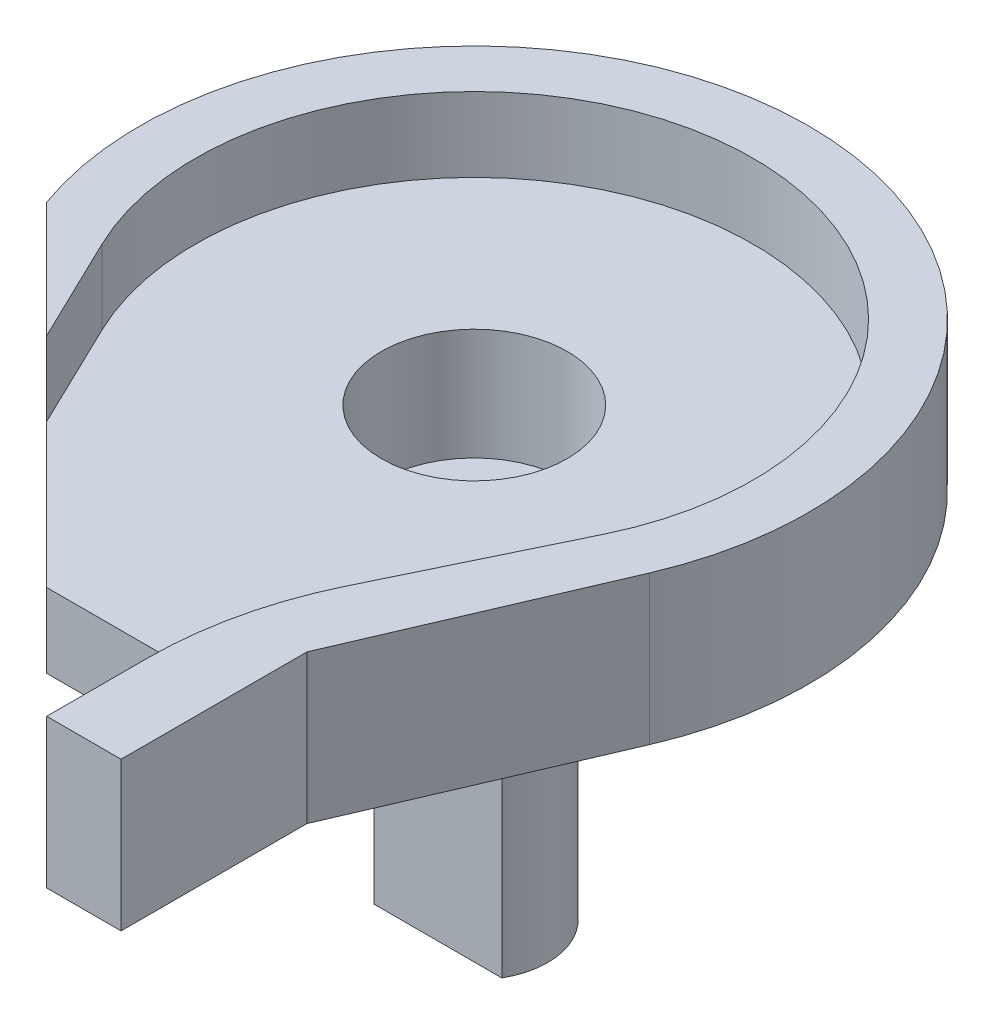
ISO-10303-21;
HEADER;
FILE_DESCRIPTION(('STEP AP214'),'2;1');
FILE_NAME('part.step','',(''),(''),'','','');
FILE_SCHEMA(('AUTOMOTIVE_DESIGN { 1 0 10303 214 1 1 1 1 }'));
ENDSEC;
DATA;
#1=APPLICATION_CONTEXT('core data for automotive mechanical design processes');
#2=APPLICATION_PROTOCOL_DEFINITION('international standard','automotive_design',2000,#1);
#3=PRODUCT_CONTEXT('',#1,'mechanical');
#4=PRODUCT('Part','Part','',(#3));
#5=PRODUCT_RELATED_PRODUCT_CATEGORY('part','',(#4));
#6=PRODUCT_DEFINITION_FORMATION('','',#4);
#7=PRODUCT_DEFINITION_CONTEXT('part definition',#1,'design');
#8=PRODUCT_DEFINITION('design','',#6,#7);
#9=PRODUCT_DEFINITION_SHAPE('','',#8);
#10=(LENGTH_UNIT() NAMED_UNIT(*) SI_UNIT(.MILLI.,.METRE.));
#11=(NAMED_UNIT(*) PLANE_ANGLE_UNIT() SI_UNIT($,.RADIAN.));
#12=(NAMED_UNIT(*) SI_UNIT($,.STERADIAN.) SOLID_ANGLE_UNIT());
#13=UNCERTAINTY_MEASURE_WITH_UNIT(LENGTH_MEASURE(1.E-05),#10,'distance_accuracy_value','');
#14=(GEOMETRIC_REPRESENTATION_CONTEXT(3) GLOBAL_UNCERTAINTY_ASSIGNED_CONTEXT((#13)) GLOBAL_UNIT_ASSIGNED_CONTEXT((#10,
#11,#12)) REPRESENTATION_CONTEXT('',''));
#15=CARTESIAN_POINT('',(0.,0.,0.));
#16=DIRECTION('',(0.,0.,1.));
#17=DIRECTION('',(1.,0.,0.));
#18=AXIS2_PLACEMENT_3D('',#15,#16,#17);
#19=CARTESIAN_POINT('',(-5.5,4.,10.));
#20=DIRECTION('',(0.,0.,-1.));
#21=DIRECTION('',(-1.,0.,0.));
#22=AXIS2_PLACEMENT_3D('',#19,#20,#21);
#23=PLANE('',#22);
#24=DIRECTION('',(1.,0.,0.));
#25=VECTOR('',#24,1.);
#26=CARTESIAN_POINT('',(-3.5,2.,10.));
#27=LINE('',#26,#25);
#28=CARTESIAN_POINT('',(-1.5,2.,10.));
#29=VERTEX_POINT('',#28);
#30=CARTESIAN_POINT('',(3.5,2.,10.));
#31=VERTEX_POINT('',#30);
#32=EDGE_CURVE('E147',#29,#31,#27,.T.);
#33=ORIENTED_EDGE('',*,*,#32,.F.);
#34=DIRECTION('',(0.,-1.,0.));
#35=VECTOR('',#34,1.);
#36=CARTESIAN_POINT('',(-1.5,10.,10.));
#37=LINE('',#36,#35);
#38=CARTESIAN_POINT('',(-1.5,0.,10.));
#39=VERTEX_POINT('',#38);
#40=EDGE_CURVE('E49',#29,#39,#37,.T.);
#41=ORIENTED_EDGE('',*,*,#40,.T.);
#42=DIRECTION('',(1.,0.,0.));
#43=VECTOR('',#42,1.);
#44=CARTESIAN_POINT('',(-5.5,0.,10.));
#45=LINE('',#44,#43);
#46=CARTESIAN_POINT('',(3.5,0.,10.));
#47=VERTEX_POINT('',#46);
#48=EDGE_CURVE('E145',#39,#47,#45,.T.);
#49=ORIENTED_EDGE('',*,*,#48,.T.);
#50=DIRECTION('',(0.,-1.,0.));
#51=VECTOR('',#50,1.);
#52=CARTESIAN_POINT('',(3.5,4.,10.));
#53=LINE('',#52,#51);
#54=EDGE_CURVE('E184',#31,#47,#53,.T.);
#55=ORIENTED_EDGE('',*,*,#54,.F.);
#56=EDGE_LOOP('',(#33,#41,#49,#55));
#57=FACE_BOUND('',#56,.T.);
#58=ADVANCED_FACE('F35',(#57),#23,.F.);
#59=CARTESIAN_POINT('',(0.,0.,0.));
#60=DIRECTION('',(0.,1.,0.));
#61=DIRECTION('',(0.,0.,1.));
#62=AXIS2_PLACEMENT_3D('',#59,#60,#61);
#63=PLANE('',#62);
#64=CARTESIAN_POINT('',(0.,0.,0.));
#65=DIRECTION('',(0.,1.,0.));
#66=DIRECTION('',(0.,0.,1.));
#67=AXIS2_PLACEMENT_3D('',#64,#65,#66);
#68=CIRCLE('',#67,3.99999999999999);
#69=CARTESIAN_POINT('',(0.,0.,3.99999999999999));
#70=VERTEX_POINT('',#69);
#71=EDGE_CURVE('E178',#70,#70,#68,.T.);
#72=ORIENTED_EDGE('',*,*,#71,.T.);
#73=EDGE_LOOP('',(#72));
#74=FACE_BOUND('',#73,.T.);
#75=ORIENTED_EDGE('',*,*,#48,.F.);
#76=DIRECTION('',(0.707106781186551,0.,0.707106781186544));
#77=VECTOR('',#76,1.);
#78=CARTESIAN_POINT('',(-1.5,0.,10.));
#79=LINE('',#78,#77);
#80=CARTESIAN_POINT('',(-8.47717802865888,0.,3.02282197134119));
#81=VERTEX_POINT('',#80);
#82=EDGE_CURVE('E133',#81,#39,#79,.T.);
#83=ORIENTED_EDGE('',*,*,#82,.F.);
#84=CARTESIAN_POINT('',(0.,0.,0.));
#85=DIRECTION('',(0.,1.,0.));
#86=DIRECTION('',(0.,0.,1.));
#87=AXIS2_PLACEMENT_3D('',#84,#85,#86);
#88=CIRCLE('',#87,9.);
#89=CARTESIAN_POINT('',(8.26952090704659,0.,3.55176350112437));
#90=VERTEX_POINT('',#89);
#91=EDGE_CURVE('E155',#90,#81,#88,.T.);
#92=ORIENTED_EDGE('',*,*,#91,.F.);
#93=DIRECTION('',(0.394640389013819,0.,-0.918835656338511));
#94=VECTOR('',#93,1.);
#95=CARTESIAN_POINT('',(5.5,0.,10.));
#96=LINE('',#95,#94);
#97=CARTESIAN_POINT('',(5.5,0.,10.));
#98=VERTEX_POINT('',#97);
#99=EDGE_CURVE('E154',#98,#90,#96,.T.);
#100=ORIENTED_EDGE('',*,*,#99,.F.);
#101=DIRECTION('',(0.,0.,-1.));
#102=VECTOR('',#101,1.);
#103=CARTESIAN_POINT('',(5.5,0.,15.));
#104=LINE('',#103,#102);
#105=CARTESIAN_POINT('',(5.5,0.,15.));
#106=VERTEX_POINT('',#105);
#107=EDGE_CURVE('E227',#106,#98,#104,.T.);
#108=ORIENTED_EDGE('',*,*,#107,.F.);
#109=DIRECTION('',(1.,0.,0.));
#110=VECTOR('',#109,1.);
#111=CARTESIAN_POINT('',(3.5,0.,15.));
#112=LINE('',#111,#110);
#113=CARTESIAN_POINT('',(3.5,0.,15.));
#114=VERTEX_POINT('',#113);
#115=EDGE_CURVE('E283',#114,#106,#112,.T.);
#116=ORIENTED_EDGE('',*,*,#115,.F.);
#117=DIRECTION('',(0.,0.,-1.));
#118=VECTOR('',#117,1.);
#119=CARTESIAN_POINT('',(3.5,0.,15.));
#120=LINE('',#119,#118);
#121=EDGE_CURVE('E153',#114,#47,#120,.T.);
#122=ORIENTED_EDGE('',*,*,#121,.T.);
#123=EDGE_LOOP('',(#75,#83,#92,#100,#108,#116,#122));
#124=FACE_BOUND('',#123,.T.);
#125=ADVANCED_FACE('F151',(#74,#124),#63,.F.);
#126=CARTESIAN_POINT('',(0.,4.,0.));
#127=DIRECTION('',(0.,-1.,0.));
#128=DIRECTION('',(0.,0.,-1.));
#129=AXIS2_PLACEMENT_3D('',#126,#127,#128);
#130=CYLINDRICAL_SURFACE('',#129,9.);
#131=ORIENTED_EDGE('',*,*,#91,.T.);
#132=DIRECTION('',(0.,-1.,0.));
#133=VECTOR('',#132,1.);
#134=CARTESIAN_POINT('',(-8.47717802865888,4.,3.02282197134119));
#135=LINE('',#134,#133);
#136=CARTESIAN_POINT('',(-8.47717802865888,4.,3.02282197134119));
#137=VERTEX_POINT('',#136);
#138=EDGE_CURVE('E136',#81,#137,#135,.F.);
#139=ORIENTED_EDGE('',*,*,#138,.T.);
#140=CARTESIAN_POINT('',(0.,4.,0.));
#141=DIRECTION('',(0.,1.,0.));
#142=DIRECTION('',(0.,0.,1.));
#143=AXIS2_PLACEMENT_3D('',#140,#141,#142);
#144=CIRCLE('',#143,9.);
#145=CARTESIAN_POINT('',(8.26952090704659,4.,3.55176350112437));
#146=VERTEX_POINT('',#145);
#147=EDGE_CURVE('E157',#146,#137,#144,.T.);
#148=ORIENTED_EDGE('',*,*,#147,.F.);
#149=DIRECTION('',(0.,-1.,0.));
#150=VECTOR('',#149,1.);
#151=CARTESIAN_POINT('',(8.26952090704659,4.,3.55176350112437));
#152=LINE('',#151,#150);
#153=EDGE_CURVE('E163',#146,#90,#152,.T.);
#154=ORIENTED_EDGE('',*,*,#153,.T.);
#155=EDGE_LOOP('',(#131,#139,#148,#154));
#156=FACE_BOUND('',#155,.T.);
#157=ADVANCED_FACE('F280',(#156),#130,.T.);
#158=CARTESIAN_POINT('',(5.5,4.,10.));
#159=DIRECTION('',(-0.918835656338511,0.,-0.394640389013819));
#160=DIRECTION('',(-0.394640389013819,0.,0.918835656338511));
#161=AXIS2_PLACEMENT_3D('',#158,#159,#160);
#162=PLANE('',#161);
#163=ORIENTED_EDGE('',*,*,#99,.T.);
#164=ORIENTED_EDGE('',*,*,#153,.F.);
#165=DIRECTION('',(0.394640389013819,0.,-0.918835656338511));
#166=VECTOR('',#165,1.);
#167=CARTESIAN_POINT('',(5.5,4.,10.));
#168=LINE('',#167,#166);
#169=CARTESIAN_POINT('',(5.5,4.,10.));
#170=VERTEX_POINT('',#169);
#171=EDGE_CURVE('E167',#170,#146,#168,.T.);
#172=ORIENTED_EDGE('',*,*,#171,.F.);
#173=DIRECTION('',(0.,-1.,0.));
#174=VECTOR('',#173,1.);
#175=CARTESIAN_POINT('',(5.5,4.,10.));
#176=LINE('',#175,#174);
#177=EDGE_CURVE('E166',#170,#98,#176,.T.);
#178=ORIENTED_EDGE('',*,*,#177,.T.);
#179=EDGE_LOOP('',(#163,#164,#172,#178));
#180=FACE_BOUND('',#179,.T.);
#181=ADVANCED_FACE('F277',(#180),#162,.F.);
#182=CARTESIAN_POINT('',(0.,4.,0.));
#183=DIRECTION('',(0.,1.,0.));
#184=DIRECTION('',(0.,0.,1.));
#185=AXIS2_PLACEMENT_3D('',#182,#183,#184);
#186=PLANE('',#185);
#187=DIRECTION('',(-0.707106781186551,0.,-0.707106781186544));
#188=VECTOR('',#187,1.);
#189=CARTESIAN_POINT('',(-5.74999999999999,4.,5.75000000000005));
#190=LINE('',#189,#188);
#191=CARTESIAN_POINT('',(-5.36737952119306,4.,6.13262047880699));
#192=VERTEX_POINT('',#191);
#193=EDGE_CURVE('E281',#192,#137,#190,.T.);
#194=ORIENTED_EDGE('',*,*,#193,.F.);
#195=DIRECTION('',(0.434818693029687,0.,0.900518019915179));
#196=VECTOR('',#195,1.);
#197=CARTESIAN_POINT('',(-6.75388514936384,4.,3.26114019772266));
#198=LINE('',#197,#196);
#199=CARTESIAN_POINT('',(-6.75388514936384,4.,3.26114019772266));
#200=VERTEX_POINT('',#199);
#201=EDGE_CURVE('E264',#200,#192,#198,.T.);
#202=ORIENTED_EDGE('',*,*,#201,.F.);
#203=CARTESIAN_POINT('',(0.,4.,0.));
#204=DIRECTION('',(0.,1.,0.));
#205=DIRECTION('',(0.,0.,1.));
#206=AXIS2_PLACEMENT_3D('',#203,#204,#205);
#207=CIRCLE('',#206,7.5);
#208=CARTESIAN_POINT('',(6.75388514936384,4.,3.26114019772266));
#209=VERTEX_POINT('',#208);
#210=EDGE_CURVE('E256',#209,#200,#207,.T.);
#211=ORIENTED_EDGE('',*,*,#210,.F.);
#212=DIRECTION('',(0.434818693029687,0.,-0.900518019915179));
#213=VECTOR('',#212,1.);
#214=CARTESIAN_POINT('',(3.5,4.,10.));
#215=LINE('',#214,#213);
#216=CARTESIAN_POINT('',(4.49481980084821,4.,7.93970873011414));
#217=VERTEX_POINT('',#216);
#218=EDGE_CURVE('E218',#217,#209,#215,.T.);
#219=ORIENTED_EDGE('',*,*,#218,.F.);
#220=CARTESIAN_POINT('',(13.5,4.,12.287895660411));
#221=DIRECTION('',(0.,1.,0.));
#222=DIRECTION('',(0.,0.,1.));
#223=AXIS2_PLACEMENT_3D('',#220,#221,#222);
#224=CIRCLE('',#223,10.);
#225=CARTESIAN_POINT('',(3.5,4.,12.287895660411));
#226=VERTEX_POINT('',#225);
#227=EDGE_CURVE('E188',#217,#226,#224,.T.);
#228=ORIENTED_EDGE('',*,*,#227,.T.);
#229=DIRECTION('',(0.,0.,-1.));
#230=VECTOR('',#229,1.);
#231=CARTESIAN_POINT('',(3.5,4.,15.));
#232=LINE('',#231,#230);
#233=CARTESIAN_POINT('',(3.5,4.,15.));
#234=VERTEX_POINT('',#233);
#235=EDGE_CURVE('E215',#234,#226,#232,.T.);
#236=ORIENTED_EDGE('',*,*,#235,.F.);
#237=DIRECTION('',(-1.,0.,0.));
#238=VECTOR('',#237,1.);
#239=CARTESIAN_POINT('',(3.5,4.,15.));
#240=LINE('',#239,#238);
#241=CARTESIAN_POINT('',(5.5,4.,15.));
#242=VERTEX_POINT('',#241);
#243=EDGE_CURVE('E224',#242,#234,#240,.T.);
#244=ORIENTED_EDGE('',*,*,#243,.F.);
#245=DIRECTION('',(0.,0.,-1.));
#246=VECTOR('',#245,1.);
#247=CARTESIAN_POINT('',(5.5,4.,15.));
#248=LINE('',#247,#246);
#249=EDGE_CURVE('E223',#242,#170,#248,.T.);
#250=ORIENTED_EDGE('',*,*,#249,.T.);
#251=ORIENTED_EDGE('',*,*,#171,.T.);
#252=ORIENTED_EDGE('',*,*,#147,.T.);
#253=EDGE_LOOP('',(#194,#202,#211,#219,#228,#236,#244,#250,#251,#252));
#254=FACE_BOUND('',#253,.T.);
#255=ADVANCED_FACE('F213',(#254),#186,.T.);
#256=CARTESIAN_POINT('',(0.,2.,0.));
#257=DIRECTION('',(0.,1.,0.));
#258=DIRECTION('',(0.,0.,1.));
#259=AXIS2_PLACEMENT_3D('',#256,#257,#258);
#260=CYLINDRICAL_SURFACE('',#259,7.5);
#261=ORIENTED_EDGE('',*,*,#210,.T.);
#262=DIRECTION('',(0.,1.,0.));
#263=VECTOR('',#262,1.);
#264=CARTESIAN_POINT('',(-6.75388514936384,2.,3.26114019772266));
#265=LINE('',#264,#263);
#266=CARTESIAN_POINT('',(-6.75388514936384,2.,3.26114019772266));
#267=VERTEX_POINT('',#266);
#268=EDGE_CURVE('E207',#267,#200,#265,.T.);
#269=ORIENTED_EDGE('',*,*,#268,.F.);
#270=CARTESIAN_POINT('',(0.,2.,0.));
#271=DIRECTION('',(0.,1.,0.));
#272=DIRECTION('',(0.,0.,1.));
#273=AXIS2_PLACEMENT_3D('',#270,#271,#272);
#274=CIRCLE('',#273,7.5);
#275=CARTESIAN_POINT('',(6.75388514936384,2.,3.26114019772266));
#276=VERTEX_POINT('',#275);
#277=EDGE_CURVE('E257',#276,#267,#274,.T.);
#278=ORIENTED_EDGE('',*,*,#277,.F.);
#279=DIRECTION('',(0.,1.,0.));
#280=VECTOR('',#279,1.);
#281=CARTESIAN_POINT('',(6.75388514936384,2.,3.26114019772266));
#282=LINE('',#281,#280);
#283=EDGE_CURVE('E159',#276,#209,#282,.T.);
#284=ORIENTED_EDGE('',*,*,#283,.T.);
#285=EDGE_LOOP('',(#261,#269,#278,#284));
#286=FACE_BOUND('',#285,.T.);
#287=ADVANCED_FACE('F365',(#286),#260,.F.);
#288=CARTESIAN_POINT('',(3.5,2.,10.));
#289=DIRECTION('',(0.900518019915179,0.,0.434818693029687));
#290=DIRECTION('',(0.434818693029687,0.,-0.900518019915179));
#291=AXIS2_PLACEMENT_3D('',#288,#289,#290);
#292=PLANE('',#291);
#293=DIRECTION('',(0.434818693029687,0.,-0.900518019915179));
#294=VECTOR('',#293,1.);
#295=CARTESIAN_POINT('',(3.5,2.,10.));
#296=LINE('',#295,#294);
#297=CARTESIAN_POINT('',(4.49481980084821,2.,7.93970873011414));
#298=VERTEX_POINT('',#297);
#299=EDGE_CURVE('E197',#298,#276,#296,.T.);
#300=ORIENTED_EDGE('',*,*,#299,.F.);
#301=DIRECTION('',(0.,1.,0.));
#302=VECTOR('',#301,1.);
#303=CARTESIAN_POINT('',(4.49481980084821,2.,7.93970873011414));
#304=LINE('',#303,#302);
#305=EDGE_CURVE('E185',#298,#217,#304,.T.);
#306=ORIENTED_EDGE('',*,*,#305,.T.);
#307=ORIENTED_EDGE('',*,*,#218,.T.);
#308=ORIENTED_EDGE('',*,*,#283,.F.);
#309=EDGE_LOOP('',(#300,#306,#307,#308));
#310=FACE_BOUND('',#309,.T.);
#311=ADVANCED_FACE('F203',(#310),#292,.F.);
#312=CARTESIAN_POINT('',(-6.75388514936384,2.,3.26114019772266));
#313=DIRECTION('',(-0.900518019915179,0.,0.434818693029687));
#314=DIRECTION('',(0.434818693029687,0.,0.900518019915179));
#315=AXIS2_PLACEMENT_3D('',#312,#313,#314);
#316=PLANE('',#315);
#317=ORIENTED_EDGE('',*,*,#201,.T.);
#318=DIRECTION('',(0.,-1.,0.));
#319=VECTOR('',#318,1.);
#320=CARTESIAN_POINT('',(-5.36737952119306,2.,6.13262047880699));
#321=LINE('',#320,#319);
#322=CARTESIAN_POINT('',(-5.36737952119306,2.,6.13262047880698));
#323=VERTEX_POINT('',#322);
#324=EDGE_CURVE('E148',#192,#323,#321,.T.);
#325=ORIENTED_EDGE('',*,*,#324,.T.);
#326=DIRECTION('',(0.434818693029687,0.,0.900518019915179));
#327=VECTOR('',#326,1.);
#328=CARTESIAN_POINT('',(-6.75388514936384,2.,3.26114019772266));
#329=LINE('',#328,#327);
#330=EDGE_CURVE('E259',#267,#323,#329,.T.);
#331=ORIENTED_EDGE('',*,*,#330,.F.);
#332=ORIENTED_EDGE('',*,*,#268,.T.);
#333=EDGE_LOOP('',(#317,#325,#331,#332));
#334=FACE_BOUND('',#333,.T.);
#335=ADVANCED_FACE('F362',(#334),#316,.F.);
#336=CARTESIAN_POINT('',(0.,2.,0.));
#337=DIRECTION('',(0.,1.,0.));
#338=DIRECTION('',(0.,0.,1.));
#339=AXIS2_PLACEMENT_3D('',#336,#337,#338);
#340=PLANE('',#339);
#341=DIRECTION('',(-0.707106781186551,0.,-0.707106781186544));
#342=VECTOR('',#341,1.);
#343=CARTESIAN_POINT('',(-5.74999999999999,2.,5.75000000000005));
#344=LINE('',#343,#342);
#345=EDGE_CURVE('E11',#29,#323,#344,.T.);
#346=ORIENTED_EDGE('',*,*,#345,.F.);
#347=ORIENTED_EDGE('',*,*,#32,.T.);
#348=DIRECTION('',(0.,0.,-1.));
#349=VECTOR('',#348,1.);
#350=CARTESIAN_POINT('',(3.5,2.,0.));
#351=LINE('',#350,#349);
#352=CARTESIAN_POINT('',(3.5,2.,12.287895660411));
#353=VERTEX_POINT('',#352);
#354=EDGE_CURVE('E57',#353,#31,#351,.T.);
#355=ORIENTED_EDGE('',*,*,#354,.F.);
#356=CARTESIAN_POINT('',(13.5,2.,12.287895660411));
#357=DIRECTION('',(0.,1.,0.));
#358=DIRECTION('',(0.,0.,1.));
#359=AXIS2_PLACEMENT_3D('',#356,#357,#358);
#360=CIRCLE('',#359,10.);
#361=EDGE_CURVE('E43',#353,#298,#360,.F.);
#362=ORIENTED_EDGE('',*,*,#361,.T.);
#363=ORIENTED_EDGE('',*,*,#299,.T.);
#364=ORIENTED_EDGE('',*,*,#277,.T.);
#365=ORIENTED_EDGE('',*,*,#330,.T.);
#366=EDGE_LOOP('',(#346,#347,#355,#362,#363,#364,#365));
#367=FACE_BOUND('',#366,.T.);
#368=CARTESIAN_POINT('',(0.,2.,0.));
#369=DIRECTION('',(0.,1.,0.));
#370=DIRECTION('',(0.,0.,1.));
#371=AXIS2_PLACEMENT_3D('',#368,#369,#370);
#372=CIRCLE('',#371,2.5);
#373=CARTESIAN_POINT('',(0.,2.,2.5));
#374=VERTEX_POINT('',#373);
#375=EDGE_CURVE('E236',#374,#374,#372,.T.);
#376=ORIENTED_EDGE('',*,*,#375,.F.);
#377=EDGE_LOOP('',(#376));
#378=FACE_BOUND('',#377,.T.);
#379=ADVANCED_FACE('F194',(#367,#378),#340,.T.);
#380=CARTESIAN_POINT('',(0.,-4.,0.));
#381=DIRECTION('',(0.,-1.,0.));
#382=DIRECTION('',(0.,0.,-1.));
#383=AXIS2_PLACEMENT_3D('',#380,#381,#382);
#384=PLANE('',#383);
#385=CARTESIAN_POINT('',(0.,-4.,0.));
#386=DIRECTION('',(0.,-1.,0.));
#387=DIRECTION('',(0.,0.,-1.));
#388=AXIS2_PLACEMENT_3D('',#385,#386,#387);
#389=CIRCLE('',#388,2.00000000000001);
#390=CARTESIAN_POINT('',(0.,-4.,-2.00000000000001));
#391=VERTEX_POINT('',#390);
#392=EDGE_CURVE('E181',#391,#391,#389,.T.);
#393=ORIENTED_EDGE('',*,*,#392,.T.);
#394=EDGE_LOOP('',(#393));
#395=FACE_BOUND('',#394,.T.);
#396=CARTESIAN_POINT('',(0.,-4.,0.));
#397=DIRECTION('',(0.,-1.,0.));
#398=DIRECTION('',(0.,0.,-1.));
#399=AXIS2_PLACEMENT_3D('',#396,#397,#398);
#400=CIRCLE('',#399,1.975);
#401=CARTESIAN_POINT('',(-1.71755640373177,-4.,0.975));
#402=VERTEX_POINT('',#401);
#403=CARTESIAN_POINT('',(1.71755640373177,-4.,0.975));
#404=VERTEX_POINT('',#403);
#405=EDGE_CURVE('E240',#402,#404,#400,.T.);
#406=ORIENTED_EDGE('',*,*,#405,.F.);
#407=DIRECTION('',(-1.,0.,0.));
#408=VECTOR('',#407,1.);
#409=CARTESIAN_POINT('',(-1.71755640373177,-4.,0.975));
#410=LINE('',#409,#408);
#411=EDGE_CURVE('E169',#404,#402,#410,.T.);
#412=ORIENTED_EDGE('',*,*,#411,.F.);
#413=EDGE_LOOP('',(#406,#412));
#414=FACE_BOUND('',#413,.T.);
#415=ADVANCED_FACE('F333',(#395,#414),#384,.T.);
#416=CARTESIAN_POINT('',(0.,-4.,0.));
#417=DIRECTION('',(0.,1.,0.));
#418=DIRECTION('',(0.,0.,1.));
#419=AXIS2_PLACEMENT_3D('',#416,#417,#418);
#420=CYLINDRICAL_SURFACE('',#419,3.);
#421=CARTESIAN_POINT('',(0.,-1.00000000000001,0.));
#422=DIRECTION('',(0.,1.,0.));
#423=DIRECTION('',(0.,0.,1.));
#424=AXIS2_PLACEMENT_3D('',#421,#422,#423);
#425=CIRCLE('',#424,3.);
#426=CARTESIAN_POINT('',(0.,-1.00000000000001,3.));
#427=VERTEX_POINT('',#426);
#428=EDGE_CURVE('E175',#427,#427,#425,.F.);
#429=ORIENTED_EDGE('',*,*,#428,.T.);
#430=EDGE_LOOP('',(#429));
#431=FACE_BOUND('',#430,.T.);
#432=CARTESIAN_POINT('',(0.,-3.,0.));
#433=DIRECTION('',(0.,-1.,0.));
#434=DIRECTION('',(0.,0.,-1.));
#435=AXIS2_PLACEMENT_3D('',#432,#433,#434);
#436=CIRCLE('',#435,3.);
#437=CARTESIAN_POINT('',(0.,-3.,-3.));
#438=VERTEX_POINT('',#437);
#439=EDGE_CURVE('E172',#438,#438,#436,.F.);
#440=ORIENTED_EDGE('',*,*,#439,.T.);
#441=EDGE_LOOP('',(#440));
#442=FACE_BOUND('',#441,.T.);
#443=ADVANCED_FACE('F336',(#431,#442),#420,.T.);
#444=CARTESIAN_POINT('',(0.,-10.,0.));
#445=DIRECTION('',(0.,-1.,0.));
#446=DIRECTION('',(0.,0.,-1.));
#447=AXIS2_PLACEMENT_3D('',#444,#445,#446);
#448=PLANE('',#447);
#449=CARTESIAN_POINT('',(0.,-10.,0.));
#450=DIRECTION('',(0.,-1.,0.));
#451=DIRECTION('',(0.,0.,-1.));
#452=AXIS2_PLACEMENT_3D('',#449,#450,#451);
#453=CIRCLE('',#452,1.975);
#454=CARTESIAN_POINT('',(-1.71755640373177,-10.,0.975));
#455=VERTEX_POINT('',#454);
#456=CARTESIAN_POINT('',(1.71755640373177,-10.,0.975));
#457=VERTEX_POINT('',#456);
#458=EDGE_CURVE('E245',#455,#457,#453,.T.);
#459=ORIENTED_EDGE('',*,*,#458,.T.);
#460=DIRECTION('',(-1.,0.,0.));
#461=VECTOR('',#460,1.);
#462=CARTESIAN_POINT('',(-1.71755640373177,-10.,0.975));
#463=LINE('',#462,#461);
#464=EDGE_CURVE('E248',#457,#455,#463,.T.);
#465=ORIENTED_EDGE('',*,*,#464,.T.);
#466=EDGE_LOOP('',(#459,#465));
#467=FACE_BOUND('',#466,.T.);
#468=ADVANCED_FACE('F346',(#467),#448,.T.);
#469=CARTESIAN_POINT('',(-1.71755640373177,-10.,0.975));
#470=DIRECTION('',(0.,0.,-1.));
#471=DIRECTION('',(-1.,0.,0.));
#472=AXIS2_PLACEMENT_3D('',#469,#470,#471);
#473=PLANE('',#472);
#474=DIRECTION('',(0.,1.,0.));
#475=VECTOR('',#474,1.);
#476=CARTESIAN_POINT('',(1.71755640373177,-10.,0.975));
#477=LINE('',#476,#475);
#478=EDGE_CURVE('E253',#457,#404,#477,.T.);
#479=ORIENTED_EDGE('',*,*,#478,.T.);
#480=ORIENTED_EDGE('',*,*,#411,.T.);
#481=DIRECTION('',(0.,1.,0.));
#482=VECTOR('',#481,1.);
#483=CARTESIAN_POINT('',(-1.71755640373177,-10.,0.975));
#484=LINE('',#483,#482);
#485=EDGE_CURVE('E250',#455,#402,#484,.T.);
#486=ORIENTED_EDGE('',*,*,#485,.F.);
#487=ORIENTED_EDGE('',*,*,#464,.F.);
#488=EDGE_LOOP('',(#479,#480,#486,#487));
#489=FACE_BOUND('',#488,.T.);
#490=ADVANCED_FACE('F342',(#489),#473,.F.);
#491=CARTESIAN_POINT('',(0.,-10.,0.));
#492=DIRECTION('',(0.,1.,0.));
#493=DIRECTION('',(0.,0.,1.));
#494=AXIS2_PLACEMENT_3D('',#491,#492,#493);
#495=CYLINDRICAL_SURFACE('',#494,1.975);
#496=ORIENTED_EDGE('',*,*,#485,.T.);
#497=ORIENTED_EDGE('',*,*,#405,.T.);
#498=ORIENTED_EDGE('',*,*,#478,.F.);
#499=ORIENTED_EDGE('',*,*,#458,.F.);
#500=EDGE_LOOP('',(#496,#497,#498,#499));
#501=FACE_BOUND('',#500,.T.);
#502=ADVANCED_FACE('F344',(#501),#495,.T.);
#503=CARTESIAN_POINT('',(0.,-1.,0.));
#504=DIRECTION('',(0.,1.,0.));
#505=DIRECTION('',(0.,0.,1.));
#506=AXIS2_PLACEMENT_3D('',#503,#504,#505);
#507=CYLINDRICAL_SURFACE('',#506,2.5);
#508=CARTESIAN_POINT('',(0.,-1.,0.));
#509=DIRECTION('',(0.,1.,0.));
#510=DIRECTION('',(0.,0.,1.));
#511=AXIS2_PLACEMENT_3D('',#508,#509,#510);
#512=CIRCLE('',#511,2.5);
#513=CARTESIAN_POINT('',(0.,-1.,2.5));
#514=VERTEX_POINT('',#513);
#515=EDGE_CURVE('E237',#514,#514,#512,.T.);
#516=ORIENTED_EDGE('',*,*,#515,.F.);
#517=EDGE_LOOP('',(#516));
#518=FACE_BOUND('',#517,.T.);
#519=ORIENTED_EDGE('',*,*,#375,.T.);
#520=EDGE_LOOP('',(#519));
#521=FACE_BOUND('',#520,.T.);
#522=ADVANCED_FACE('F359',(#518,#521),#507,.F.);
#523=CARTESIAN_POINT('',(0.,-1.,0.));
#524=DIRECTION('',(0.,1.,0.));
#525=DIRECTION('',(0.,0.,1.));
#526=AXIS2_PLACEMENT_3D('',#523,#524,#525);
#527=PLANE('',#526);
#528=ORIENTED_EDGE('',*,*,#515,.T.);
#529=EDGE_LOOP('',(#528));
#530=FACE_BOUND('',#529,.T.);
#531=ADVANCED_FACE('F321',(#530),#527,.T.);
#532=CARTESIAN_POINT('',(0.,-1.00000000000001,0.));
#533=DIRECTION('',(0.,1.,0.));
#534=DIRECTION('',(0.,0.,1.));
#535=AXIS2_PLACEMENT_3D('',#532,#533,#534);
#536=CONICAL_SURFACE('',#535,3.,0.785398163397441);
#537=ORIENTED_EDGE('',*,*,#71,.F.);
#538=EDGE_LOOP('',(#537));
#539=FACE_BOUND('',#538,.T.);
#540=ORIENTED_EDGE('',*,*,#428,.F.);
#541=EDGE_LOOP('',(#540));
#542=FACE_BOUND('',#541,.T.);
#543=ADVANCED_FACE('F316',(#539,#542),#536,.T.);
#544=CARTESIAN_POINT('',(0.,-4.,0.));
#545=DIRECTION('',(0.,1.,0.));
#546=DIRECTION('',(0.,0.,1.));
#547=AXIS2_PLACEMENT_3D('',#544,#545,#546);
#548=CONICAL_SURFACE('',#547,2.00000000000001,0.785398163397446);
#549=ORIENTED_EDGE('',*,*,#439,.F.);
#550=EDGE_LOOP('',(#549));
#551=FACE_BOUND('',#550,.T.);
#552=ORIENTED_EDGE('',*,*,#392,.F.);
#553=EDGE_LOOP('',(#552));
#554=FACE_BOUND('',#553,.T.);
#555=ADVANCED_FACE('F302',(#551,#554),#548,.T.);
#556=CARTESIAN_POINT('',(3.5,4.,15.));
#557=DIRECTION('',(1.,0.,0.));
#558=DIRECTION('',(0.,1.,0.));
#559=AXIS2_PLACEMENT_3D('',#556,#557,#558);
#560=PLANE('',#559);
#561=ORIENTED_EDGE('',*,*,#235,.T.);
#562=DIRECTION('',(0.,1.,0.));
#563=VECTOR('',#562,1.);
#564=CARTESIAN_POINT('',(3.5,4.,12.287895660411));
#565=LINE('',#564,#563);
#566=EDGE_CURVE('E191',#226,#353,#565,.F.);
#567=ORIENTED_EDGE('',*,*,#566,.T.);
#568=ORIENTED_EDGE('',*,*,#354,.T.);
#569=ORIENTED_EDGE('',*,*,#54,.T.);
#570=ORIENTED_EDGE('',*,*,#121,.F.);
#571=DIRECTION('',(0.,-1.,0.));
#572=VECTOR('',#571,1.);
#573=CARTESIAN_POINT('',(3.5,4.,15.));
#574=LINE('',#573,#572);
#575=EDGE_CURVE('E222',#234,#114,#574,.T.);
#576=ORIENTED_EDGE('',*,*,#575,.F.);
#577=EDGE_LOOP('',(#561,#567,#568,#569,#570,#576));
#578=FACE_BOUND('',#577,.T.);
#579=ADVANCED_FACE('F220',(#578),#560,.F.);
#580=CARTESIAN_POINT('',(5.5,4.,15.));
#581=DIRECTION('',(-1.,0.,0.));
#582=DIRECTION('',(0.,0.,1.));
#583=AXIS2_PLACEMENT_3D('',#580,#581,#582);
#584=PLANE('',#583);
#585=ORIENTED_EDGE('',*,*,#177,.F.);
#586=ORIENTED_EDGE('',*,*,#249,.F.);
#587=DIRECTION('',(0.,1.,0.));
#588=VECTOR('',#587,1.);
#589=CARTESIAN_POINT('',(5.5,4.,15.));
#590=LINE('',#589,#588);
#591=EDGE_CURVE('E229',#106,#242,#590,.T.);
#592=ORIENTED_EDGE('',*,*,#591,.F.);
#593=ORIENTED_EDGE('',*,*,#107,.T.);
#594=EDGE_LOOP('',(#585,#586,#592,#593));
#595=FACE_BOUND('',#594,.T.);
#596=ADVANCED_FACE('F294',(#595),#584,.F.);
#597=CARTESIAN_POINT('',(0.,0.,15.));
#598=DIRECTION('',(0.,0.,1.));
#599=DIRECTION('',(1.,0.,0.));
#600=AXIS2_PLACEMENT_3D('',#597,#598,#599);
#601=PLANE('',#600);
#602=ORIENTED_EDGE('',*,*,#575,.T.);
#603=ORIENTED_EDGE('',*,*,#115,.T.);
#604=ORIENTED_EDGE('',*,*,#591,.T.);
#605=ORIENTED_EDGE('',*,*,#243,.T.);
#606=EDGE_LOOP('',(#602,#603,#604,#605));
#607=FACE_BOUND('',#606,.T.);
#608=ADVANCED_FACE('F291',(#607),#601,.T.);
#609=CARTESIAN_POINT('',(13.5,2.,12.287895660411));
#610=DIRECTION('',(0.,1.,0.));
#611=DIRECTION('',(0.,0.,1.));
#612=AXIS2_PLACEMENT_3D('',#609,#610,#611);
#613=CYLINDRICAL_SURFACE('',#612,10.);
#614=ORIENTED_EDGE('',*,*,#361,.F.);
#615=ORIENTED_EDGE('',*,*,#566,.F.);
#616=ORIENTED_EDGE('',*,*,#227,.F.);
#617=ORIENTED_EDGE('',*,*,#305,.F.);
#618=EDGE_LOOP('',(#614,#615,#616,#617));
#619=FACE_BOUND('',#618,.T.);
#620=ADVANCED_FACE('F37',(#619),#613,.T.);
#621=CARTESIAN_POINT('',(-1.5,10.,10.));
#622=DIRECTION('',(0.707106781186544,0.,-0.707106781186551));
#623=DIRECTION('',(-0.707106781186551,0.,-0.707106781186544));
#624=AXIS2_PLACEMENT_3D('',#621,#622,#623);
#625=PLANE('',#624);
#626=ORIENTED_EDGE('',*,*,#82,.T.);
#627=ORIENTED_EDGE('',*,*,#40,.F.);
#628=ORIENTED_EDGE('',*,*,#345,.T.);
#629=ORIENTED_EDGE('',*,*,#324,.F.);
#630=ORIENTED_EDGE('',*,*,#193,.T.);
#631=ORIENTED_EDGE('',*,*,#138,.F.);
#632=EDGE_LOOP('',(#626,#627,#628,#629,#630,#631));
#633=FACE_BOUND('',#632,.T.);
#634=ADVANCED_FACE('F134',(#633),#625,.F.);
#635=CLOSED_SHELL('',(#58,#125,#157,#181,#255,#287,#311,#335,#379,#415,#443,#468,#490,#502,#522,
#531,#543,#555,#579,#596,#608,#620,#634));
#636=MANIFOLD_SOLID_BREP('B2',#635);
#637=ADVANCED_BREP_SHAPE_REPRESENTATION('',(#18,#636),#14);
#638=SHAPE_DEFINITION_REPRESENTATION(#9,#637);
ENDSEC;
END-ISO-10303-21;
